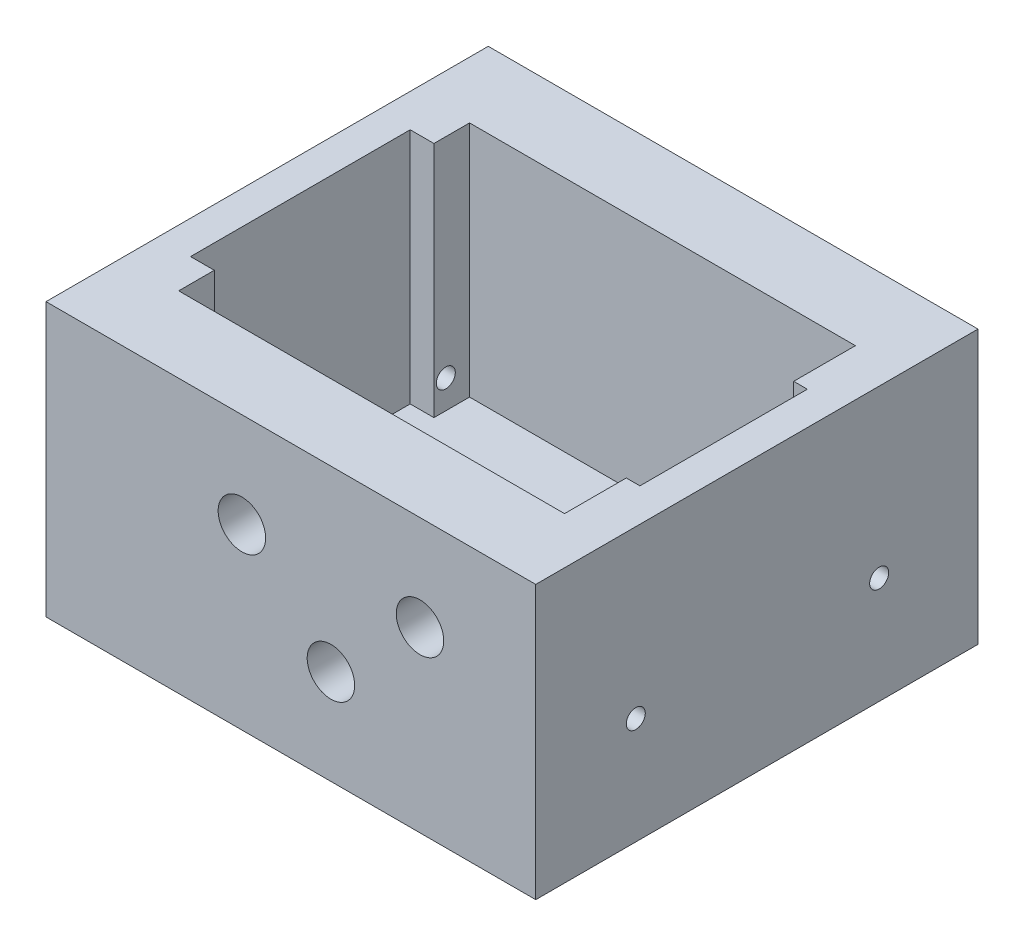
ISO-10303-21;
HEADER;
FILE_DESCRIPTION(('STEP AP214'),'2;1');
FILE_NAME('part.step','',(''),(''),'','','');
FILE_SCHEMA(('AUTOMOTIVE_DESIGN { 1 0 10303 214 1 1 1 1 }'));
ENDSEC;
DATA;
#1=APPLICATION_CONTEXT('core data for automotive mechanical design processes');
#2=APPLICATION_PROTOCOL_DEFINITION('international standard','automotive_design',2000,#1);
#3=PRODUCT_CONTEXT('',#1,'mechanical');
#4=PRODUCT('Part','Part','',(#3));
#5=PRODUCT_RELATED_PRODUCT_CATEGORY('part','',(#4));
#6=PRODUCT_DEFINITION_FORMATION('','',#4);
#7=PRODUCT_DEFINITION_CONTEXT('part definition',#1,'design');
#8=PRODUCT_DEFINITION('design','',#6,#7);
#9=PRODUCT_DEFINITION_SHAPE('','',#8);
#10=(LENGTH_UNIT() NAMED_UNIT(*) SI_UNIT(.MILLI.,.METRE.));
#11=(NAMED_UNIT(*) PLANE_ANGLE_UNIT() SI_UNIT($,.RADIAN.));
#12=(NAMED_UNIT(*) SI_UNIT($,.STERADIAN.) SOLID_ANGLE_UNIT());
#13=UNCERTAINTY_MEASURE_WITH_UNIT(LENGTH_MEASURE(1.E-05),#10,'distance_accuracy_value','');
#14=(GEOMETRIC_REPRESENTATION_CONTEXT(3) GLOBAL_UNCERTAINTY_ASSIGNED_CONTEXT((#13)) GLOBAL_UNIT_ASSIGNED_CONTEXT((#10,
#11,#12)) REPRESENTATION_CONTEXT('',''));
#15=CARTESIAN_POINT('',(0.,0.,0.));
#16=DIRECTION('',(0.,0.,1.));
#17=DIRECTION('',(1.,0.,0.));
#18=AXIS2_PLACEMENT_3D('',#15,#16,#17);
#19=CARTESIAN_POINT('',(0.,23.,0.));
#20=DIRECTION('',(1.,0.,0.));
#21=DIRECTION('',(0.,0.,-1.));
#22=AXIS2_PLACEMENT_3D('',#19,#20,#21);
#23=PLANE('',#22);
#24=CARTESIAN_POINT('',(0.,5.4,-28.875));
#25=DIRECTION('',(1.,0.,0.));
#26=DIRECTION('',(0.,0.,-1.));
#27=AXIS2_PLACEMENT_3D('',#24,#25,#26);
#28=CIRCLE('',#27,0.799999999999999);
#29=CARTESIAN_POINT('',(0.,5.4,-29.675));
#30=VERTEX_POINT('',#29);
#31=EDGE_CURVE('E324',#30,#30,#28,.F.);
#32=ORIENTED_EDGE('',*,*,#31,.F.);
#33=EDGE_LOOP('',(#32));
#34=FACE_BOUND('',#33,.T.);
#35=CARTESIAN_POINT('',(0.,5.4,-8.375));
#36=DIRECTION('',(1.,0.,0.));
#37=DIRECTION('',(0.,0.,-1.));
#38=AXIS2_PLACEMENT_3D('',#35,#36,#37);
#39=CIRCLE('',#38,0.800000000000001);
#40=CARTESIAN_POINT('',(0.,5.4,-9.175));
#41=VERTEX_POINT('',#40);
#42=EDGE_CURVE('E327',#41,#41,#39,.F.);
#43=ORIENTED_EDGE('',*,*,#42,.F.);
#44=EDGE_LOOP('',(#43));
#45=FACE_BOUND('',#44,.T.);
#46=DIRECTION('',(0.,0.,1.));
#47=VECTOR('',#46,1.);
#48=CARTESIAN_POINT('',(0.,0.,0.));
#49=LINE('',#48,#47);
#50=CARTESIAN_POINT('',(0.,0.,-37.25));
#51=VERTEX_POINT('',#50);
#52=CARTESIAN_POINT('',(0.,0.,0.));
#53=VERTEX_POINT('',#52);
#54=EDGE_CURVE('E250',#51,#53,#49,.T.);
#55=ORIENTED_EDGE('',*,*,#54,.T.);
#56=DIRECTION('',(0.,-1.,0.));
#57=VECTOR('',#56,1.);
#58=CARTESIAN_POINT('',(0.,23.,0.));
#59=LINE('',#58,#57);
#60=CARTESIAN_POINT('',(0.,23.,0.));
#61=VERTEX_POINT('',#60);
#62=EDGE_CURVE('E11',#61,#53,#59,.T.);
#63=ORIENTED_EDGE('',*,*,#62,.F.);
#64=DIRECTION('',(0.,0.,1.));
#65=VECTOR('',#64,1.);
#66=CARTESIAN_POINT('',(0.,23.,0.));
#67=LINE('',#66,#65);
#68=CARTESIAN_POINT('',(0.,23.,-37.25));
#69=VERTEX_POINT('',#68);
#70=EDGE_CURVE('E270',#69,#61,#67,.T.);
#71=ORIENTED_EDGE('',*,*,#70,.F.);
#72=DIRECTION('',(0.,-1.,0.));
#73=VECTOR('',#72,1.);
#74=CARTESIAN_POINT('',(0.,23.,-37.25));
#75=LINE('',#74,#73);
#76=EDGE_CURVE('E276',#69,#51,#75,.T.);
#77=ORIENTED_EDGE('',*,*,#76,.T.);
#78=EDGE_LOOP('',(#55,#63,#71,#77));
#79=FACE_BOUND('',#78,.T.);
#80=ADVANCED_FACE('F42',(#34,#45,#79),#23,.F.);
#81=CARTESIAN_POINT('',(0.,23.,0.));
#82=DIRECTION('',(0.,0.,-1.));
#83=DIRECTION('',(-1.,0.,0.));
#84=AXIS2_PLACEMENT_3D('',#81,#82,#83);
#85=PLANE('',#84);
#86=CARTESIAN_POINT('',(16.5,15.,0.));
#87=DIRECTION('',(0.,0.,1.));
#88=DIRECTION('',(1.,0.,0.));
#89=AXIS2_PLACEMENT_3D('',#86,#87,#88);
#90=CIRCLE('',#89,2.);
#91=CARTESIAN_POINT('',(18.5,15.,0.));
#92=VERTEX_POINT('',#91);
#93=EDGE_CURVE('E363',#92,#92,#90,.T.);
#94=ORIENTED_EDGE('',*,*,#93,.F.);
#95=EDGE_LOOP('',(#94));
#96=FACE_BOUND('',#95,.T.);
#97=CARTESIAN_POINT('',(31.5,15.,0.));
#98=DIRECTION('',(0.,0.,1.));
#99=DIRECTION('',(1.,0.,0.));
#100=AXIS2_PLACEMENT_3D('',#97,#98,#99);
#101=CIRCLE('',#100,2.);
#102=CARTESIAN_POINT('',(33.5,15.,0.));
#103=VERTEX_POINT('',#102);
#104=EDGE_CURVE('E360',#103,#103,#101,.T.);
#105=ORIENTED_EDGE('',*,*,#104,.F.);
#106=EDGE_LOOP('',(#105));
#107=FACE_BOUND('',#106,.T.);
#108=CARTESIAN_POINT('',(24.,8.,0.));
#109=DIRECTION('',(0.,0.,1.));
#110=DIRECTION('',(1.,0.,0.));
#111=AXIS2_PLACEMENT_3D('',#108,#109,#110);
#112=CIRCLE('',#111,2.);
#113=CARTESIAN_POINT('',(26.,8.,0.));
#114=VERTEX_POINT('',#113);
#115=EDGE_CURVE('E353',#114,#114,#112,.T.);
#116=ORIENTED_EDGE('',*,*,#115,.F.);
#117=EDGE_LOOP('',(#116));
#118=FACE_BOUND('',#117,.T.);
#119=DIRECTION('',(1.,0.,0.));
#120=VECTOR('',#119,1.);
#121=CARTESIAN_POINT('',(0.,0.,0.));
#122=LINE('',#121,#120);
#123=CARTESIAN_POINT('',(41.25,0.,0.));
#124=VERTEX_POINT('',#123);
#125=EDGE_CURVE('E279',#53,#124,#122,.T.);
#126=ORIENTED_EDGE('',*,*,#125,.T.);
#127=DIRECTION('',(0.,-1.,0.));
#128=VECTOR('',#127,1.);
#129=CARTESIAN_POINT('',(41.25,23.,0.));
#130=LINE('',#129,#128);
#131=CARTESIAN_POINT('',(41.25,23.,0.));
#132=VERTEX_POINT('',#131);
#133=EDGE_CURVE('E49',#132,#124,#130,.T.);
#134=ORIENTED_EDGE('',*,*,#133,.F.);
#135=DIRECTION('',(1.,0.,0.));
#136=VECTOR('',#135,1.);
#137=CARTESIAN_POINT('',(0.,23.,0.));
#138=LINE('',#137,#136);
#139=EDGE_CURVE('E93',#61,#132,#138,.T.);
#140=ORIENTED_EDGE('',*,*,#139,.F.);
#141=ORIENTED_EDGE('',*,*,#62,.T.);
#142=EDGE_LOOP('',(#126,#134,#140,#141));
#143=FACE_BOUND('',#142,.T.);
#144=ADVANCED_FACE('F309',(#96,#107,#118,#143),#85,.F.);
#145=CARTESIAN_POINT('',(41.25,23.,0.));
#146=DIRECTION('',(-1.,0.,0.));
#147=DIRECTION('',(0.,0.,1.));
#148=AXIS2_PLACEMENT_3D('',#145,#146,#147);
#149=PLANE('',#148);
#150=CARTESIAN_POINT('',(41.25,9.,-28.925));
#151=DIRECTION('',(-1.,0.,0.));
#152=DIRECTION('',(0.,0.,1.));
#153=AXIS2_PLACEMENT_3D('',#150,#151,#152);
#154=CIRCLE('',#153,0.799999999999999);
#155=CARTESIAN_POINT('',(41.25,9.,-28.125));
#156=VERTEX_POINT('',#155);
#157=EDGE_CURVE('E220',#156,#156,#154,.F.);
#158=ORIENTED_EDGE('',*,*,#157,.F.);
#159=EDGE_LOOP('',(#158));
#160=FACE_BOUND('',#159,.T.);
#161=CARTESIAN_POINT('',(41.25,9.,-8.425));
#162=DIRECTION('',(-1.,0.,0.));
#163=DIRECTION('',(0.,0.,1.));
#164=AXIS2_PLACEMENT_3D('',#161,#162,#163);
#165=CIRCLE('',#164,0.800000000000002);
#166=CARTESIAN_POINT('',(41.25,9.,-7.625));
#167=VERTEX_POINT('',#166);
#168=EDGE_CURVE('E190',#167,#167,#165,.F.);
#169=ORIENTED_EDGE('',*,*,#168,.F.);
#170=EDGE_LOOP('',(#169));
#171=FACE_BOUND('',#170,.T.);
#172=DIRECTION('',(0.,0.,-1.));
#173=VECTOR('',#172,1.);
#174=CARTESIAN_POINT('',(41.25,0.,0.));
#175=LINE('',#174,#173);
#176=CARTESIAN_POINT('',(41.25,0.,-37.25));
#177=VERTEX_POINT('',#176);
#178=EDGE_CURVE('E281',#124,#177,#175,.T.);
#179=ORIENTED_EDGE('',*,*,#178,.T.);
#180=DIRECTION('',(0.,-1.,0.));
#181=VECTOR('',#180,1.);
#182=CARTESIAN_POINT('',(41.25,23.,-37.25));
#183=LINE('',#182,#181);
#184=CARTESIAN_POINT('',(41.25,23.,-37.25));
#185=VERTEX_POINT('',#184);
#186=EDGE_CURVE('E285',#185,#177,#183,.T.);
#187=ORIENTED_EDGE('',*,*,#186,.F.);
#188=DIRECTION('',(0.,0.,-1.));
#189=VECTOR('',#188,1.);
#190=CARTESIAN_POINT('',(41.25,23.,0.));
#191=LINE('',#190,#189);
#192=EDGE_CURVE('E273',#132,#185,#191,.T.);
#193=ORIENTED_EDGE('',*,*,#192,.F.);
#194=ORIENTED_EDGE('',*,*,#133,.T.);
#195=EDGE_LOOP('',(#179,#187,#193,#194));
#196=FACE_BOUND('',#195,.T.);
#197=ADVANCED_FACE('F290',(#160,#171,#196),#149,.F.);
#198=CARTESIAN_POINT('',(0.,23.,-37.25));
#199=DIRECTION('',(0.,0.,1.));
#200=DIRECTION('',(1.,0.,0.));
#201=AXIS2_PLACEMENT_3D('',#198,#199,#200);
#202=PLANE('',#201);
#203=CARTESIAN_POINT('',(16.5,15.,-37.25));
#204=DIRECTION('',(0.,0.,1.));
#205=DIRECTION('',(1.,0.,0.));
#206=AXIS2_PLACEMENT_3D('',#203,#204,#205);
#207=CIRCLE('',#206,2.);
#208=CARTESIAN_POINT('',(18.5,15.,-37.25));
#209=VERTEX_POINT('',#208);
#210=EDGE_CURVE('E380',#209,#209,#207,.T.);
#211=ORIENTED_EDGE('',*,*,#210,.T.);
#212=EDGE_LOOP('',(#211));
#213=FACE_BOUND('',#212,.T.);
#214=CARTESIAN_POINT('',(31.5,15.,-37.25));
#215=DIRECTION('',(0.,0.,1.));
#216=DIRECTION('',(1.,0.,0.));
#217=AXIS2_PLACEMENT_3D('',#214,#215,#216);
#218=CIRCLE('',#217,2.);
#219=CARTESIAN_POINT('',(33.5,15.,-37.25));
#220=VERTEX_POINT('',#219);
#221=EDGE_CURVE('E374',#220,#220,#218,.T.);
#222=ORIENTED_EDGE('',*,*,#221,.T.);
#223=EDGE_LOOP('',(#222));
#224=FACE_BOUND('',#223,.T.);
#225=CARTESIAN_POINT('',(24.,8.,-37.25));
#226=DIRECTION('',(0.,0.,1.));
#227=DIRECTION('',(1.,0.,0.));
#228=AXIS2_PLACEMENT_3D('',#225,#226,#227);
#229=CIRCLE('',#228,2.);
#230=CARTESIAN_POINT('',(26.,8.,-37.25));
#231=VERTEX_POINT('',#230);
#232=EDGE_CURVE('E368',#231,#231,#229,.T.);
#233=ORIENTED_EDGE('',*,*,#232,.T.);
#234=EDGE_LOOP('',(#233));
#235=FACE_BOUND('',#234,.T.);
#236=DIRECTION('',(-1.,0.,0.));
#237=VECTOR('',#236,1.);
#238=CARTESIAN_POINT('',(0.,0.,-37.25));
#239=LINE('',#238,#237);
#240=EDGE_CURVE('E86',#177,#51,#239,.T.);
#241=ORIENTED_EDGE('',*,*,#240,.T.);
#242=ORIENTED_EDGE('',*,*,#76,.F.);
#243=DIRECTION('',(-1.,0.,0.));
#244=VECTOR('',#243,1.);
#245=CARTESIAN_POINT('',(0.,23.,-37.25));
#246=LINE('',#245,#244);
#247=EDGE_CURVE('E65',#185,#69,#246,.T.);
#248=ORIENTED_EDGE('',*,*,#247,.F.);
#249=ORIENTED_EDGE('',*,*,#186,.T.);
#250=EDGE_LOOP('',(#241,#242,#248,#249));
#251=FACE_BOUND('',#250,.T.);
#252=ADVANCED_FACE('F298',(#213,#224,#235,#251),#202,.F.);
#253=CARTESIAN_POINT('',(0.,23.,0.));
#254=DIRECTION('',(0.,-1.,0.));
#255=DIRECTION('',(0.,0.,-1.));
#256=AXIS2_PLACEMENT_3D('',#253,#254,#255);
#257=PLANE('',#256);
#258=DIRECTION('',(-1.,0.,0.));
#259=VECTOR('',#258,1.);
#260=CARTESIAN_POINT('',(4.8,23.,-27.875));
#261=LINE('',#260,#259);
#262=CARTESIAN_POINT('',(4.8,23.,-27.875));
#263=VERTEX_POINT('',#262);
#264=CARTESIAN_POINT('',(2.80000000000001,23.,-27.875));
#265=VERTEX_POINT('',#264);
#266=EDGE_CURVE('E219',#263,#265,#261,.T.);
#267=ORIENTED_EDGE('',*,*,#266,.F.);
#268=DIRECTION('',(0.,0.,1.));
#269=VECTOR('',#268,1.);
#270=CARTESIAN_POINT('',(4.8,23.,-30.875));
#271=LINE('',#270,#269);
#272=CARTESIAN_POINT('',(4.8,23.,-30.875));
#273=VERTEX_POINT('',#272);
#274=EDGE_CURVE('E56',#273,#263,#271,.T.);
#275=ORIENTED_EDGE('',*,*,#274,.F.);
#276=DIRECTION('',(-1.,0.,0.));
#277=VECTOR('',#276,1.);
#278=CARTESIAN_POINT('',(37.3,23.,-30.875));
#279=LINE('',#278,#277);
#280=CARTESIAN_POINT('',(37.3,23.,-30.875));
#281=VERTEX_POINT('',#280);
#282=EDGE_CURVE('E184',#281,#273,#279,.T.);
#283=ORIENTED_EDGE('',*,*,#282,.F.);
#284=DIRECTION('',(0.,0.,-1.));
#285=VECTOR('',#284,1.);
#286=CARTESIAN_POINT('',(37.3,23.,-25.675));
#287=LINE('',#286,#285);
#288=CARTESIAN_POINT('',(37.3,23.,-25.675));
#289=VERTEX_POINT('',#288);
#290=EDGE_CURVE('E187',#289,#281,#287,.T.);
#291=ORIENTED_EDGE('',*,*,#290,.F.);
#292=DIRECTION('',(-1.,0.,0.));
#293=VECTOR('',#292,1.);
#294=CARTESIAN_POINT('',(38.45,23.,-25.675));
#295=LINE('',#294,#293);
#296=CARTESIAN_POINT('',(38.45,23.,-25.675));
#297=VERTEX_POINT('',#296);
#298=EDGE_CURVE('E243',#297,#289,#295,.T.);
#299=ORIENTED_EDGE('',*,*,#298,.F.);
#300=DIRECTION('',(0.,0.,-1.));
#301=VECTOR('',#300,1.);
#302=CARTESIAN_POINT('',(38.45,23.,-11.575));
#303=LINE('',#302,#301);
#304=CARTESIAN_POINT('',(38.45,23.,-11.575));
#305=VERTEX_POINT('',#304);
#306=EDGE_CURVE('E240',#305,#297,#303,.T.);
#307=ORIENTED_EDGE('',*,*,#306,.F.);
#308=DIRECTION('',(1.,0.,0.));
#309=VECTOR('',#308,1.);
#310=CARTESIAN_POINT('',(37.3,23.,-11.575));
#311=LINE('',#310,#309);
#312=CARTESIAN_POINT('',(37.3,23.,-11.575));
#313=VERTEX_POINT('',#312);
#314=EDGE_CURVE('E237',#313,#305,#311,.T.);
#315=ORIENTED_EDGE('',*,*,#314,.F.);
#316=DIRECTION('',(0.,0.,-1.));
#317=VECTOR('',#316,1.);
#318=CARTESIAN_POINT('',(37.3,23.,-6.375));
#319=LINE('',#318,#317);
#320=CARTESIAN_POINT('',(37.3,23.,-6.375));
#321=VERTEX_POINT('',#320);
#322=EDGE_CURVE('E234',#321,#313,#319,.T.);
#323=ORIENTED_EDGE('',*,*,#322,.F.);
#324=DIRECTION('',(1.,0.,0.));
#325=VECTOR('',#324,1.);
#326=CARTESIAN_POINT('',(4.80000000000001,23.,-6.375));
#327=LINE('',#326,#325);
#328=CARTESIAN_POINT('',(4.80000000000001,23.,-6.375));
#329=VERTEX_POINT('',#328);
#330=EDGE_CURVE('E231',#329,#321,#327,.T.);
#331=ORIENTED_EDGE('',*,*,#330,.F.);
#332=DIRECTION('',(0.,0.,1.));
#333=VECTOR('',#332,1.);
#334=CARTESIAN_POINT('',(4.80000000000001,23.,-9.375));
#335=LINE('',#334,#333);
#336=CARTESIAN_POINT('',(4.80000000000001,23.,-9.375));
#337=VERTEX_POINT('',#336);
#338=EDGE_CURVE('E228',#337,#329,#335,.T.);
#339=ORIENTED_EDGE('',*,*,#338,.F.);
#340=DIRECTION('',(1.,0.,0.));
#341=VECTOR('',#340,1.);
#342=CARTESIAN_POINT('',(2.80000000000001,23.,-9.375));
#343=LINE('',#342,#341);
#344=CARTESIAN_POINT('',(2.80000000000001,23.,-9.375));
#345=VERTEX_POINT('',#344);
#346=EDGE_CURVE('E225',#345,#337,#343,.T.);
#347=ORIENTED_EDGE('',*,*,#346,.F.);
#348=DIRECTION('',(0.,0.,1.));
#349=VECTOR('',#348,1.);
#350=CARTESIAN_POINT('',(2.80000000000001,23.,-27.875));
#351=LINE('',#350,#349);
#352=EDGE_CURVE('E222',#265,#345,#351,.T.);
#353=ORIENTED_EDGE('',*,*,#352,.F.);
#354=EDGE_LOOP('',(#267,#275,#283,#291,#299,#307,#315,#323,#331,#339,#347,#353));
#355=FACE_BOUND('',#354,.T.);
#356=ORIENTED_EDGE('',*,*,#70,.T.);
#357=ORIENTED_EDGE('',*,*,#139,.T.);
#358=ORIENTED_EDGE('',*,*,#192,.T.);
#359=ORIENTED_EDGE('',*,*,#247,.T.);
#360=EDGE_LOOP('',(#356,#357,#358,#359));
#361=FACE_BOUND('',#360,.T.);
#362=ADVANCED_FACE('F300',(#355,#361),#257,.F.);
#363=CARTESIAN_POINT('',(0.,0.,0.));
#364=DIRECTION('',(0.,-1.,0.));
#365=DIRECTION('',(0.,0.,-1.));
#366=AXIS2_PLACEMENT_3D('',#363,#364,#365);
#367=PLANE('',#366);
#368=ORIENTED_EDGE('',*,*,#54,.F.);
#369=ORIENTED_EDGE('',*,*,#240,.F.);
#370=ORIENTED_EDGE('',*,*,#178,.F.);
#371=ORIENTED_EDGE('',*,*,#125,.F.);
#372=EDGE_LOOP('',(#368,#369,#370,#371));
#373=FACE_BOUND('',#372,.T.);
#374=ADVANCED_FACE('F294',(#373),#367,.T.);
#375=CARTESIAN_POINT('',(4.8,3.,-30.875));
#376=DIRECTION('',(-1.,0.,0.));
#377=DIRECTION('',(0.,0.,1.));
#378=AXIS2_PLACEMENT_3D('',#375,#376,#377);
#379=PLANE('',#378);
#380=CARTESIAN_POINT('',(4.8,5.4,-28.875));
#381=DIRECTION('',(1.,0.,0.));
#382=DIRECTION('',(0.,0.,-1.));
#383=AXIS2_PLACEMENT_3D('',#380,#381,#382);
#384=CIRCLE('',#383,0.799999999999999);
#385=CARTESIAN_POINT('',(4.8,5.4,-29.675));
#386=VERTEX_POINT('',#385);
#387=EDGE_CURVE('E329',#386,#386,#384,.T.);
#388=ORIENTED_EDGE('',*,*,#387,.F.);
#389=EDGE_LOOP('',(#388));
#390=FACE_BOUND('',#389,.T.);
#391=ORIENTED_EDGE('',*,*,#274,.T.);
#392=DIRECTION('',(0.,1.,0.));
#393=VECTOR('',#392,1.);
#394=CARTESIAN_POINT('',(4.8,3.,-27.875));
#395=LINE('',#394,#393);
#396=CARTESIAN_POINT('',(4.8,3.,-27.875));
#397=VERTEX_POINT('',#396);
#398=EDGE_CURVE('E161',#397,#263,#395,.T.);
#399=ORIENTED_EDGE('',*,*,#398,.F.);
#400=DIRECTION('',(0.,0.,1.));
#401=VECTOR('',#400,1.);
#402=CARTESIAN_POINT('',(4.8,3.,-30.875));
#403=LINE('',#402,#401);
#404=CARTESIAN_POINT('',(4.8,3.,-30.875));
#405=VERTEX_POINT('',#404);
#406=EDGE_CURVE('E165',#405,#397,#403,.T.);
#407=ORIENTED_EDGE('',*,*,#406,.F.);
#408=DIRECTION('',(0.,1.,0.));
#409=VECTOR('',#408,1.);
#410=CARTESIAN_POINT('',(4.8,3.,-30.875));
#411=LINE('',#410,#409);
#412=EDGE_CURVE('E248',#405,#273,#411,.T.);
#413=ORIENTED_EDGE('',*,*,#412,.T.);
#414=EDGE_LOOP('',(#391,#399,#407,#413));
#415=FACE_BOUND('',#414,.T.);
#416=ADVANCED_FACE('F163',(#390,#415),#379,.F.);
#417=CARTESIAN_POINT('',(37.3,3.,-30.875));
#418=DIRECTION('',(0.,0.,-1.));
#419=DIRECTION('',(-1.,0.,0.));
#420=AXIS2_PLACEMENT_3D('',#417,#418,#419);
#421=PLANE('',#420);
#422=ORIENTED_EDGE('',*,*,#282,.T.);
#423=ORIENTED_EDGE('',*,*,#412,.F.);
#424=DIRECTION('',(-1.,0.,0.));
#425=VECTOR('',#424,1.);
#426=CARTESIAN_POINT('',(37.3,3.,-30.875));
#427=LINE('',#426,#425);
#428=CARTESIAN_POINT('',(37.3,3.,-30.875));
#429=VERTEX_POINT('',#428);
#430=EDGE_CURVE('E171',#429,#405,#427,.T.);
#431=ORIENTED_EDGE('',*,*,#430,.F.);
#432=DIRECTION('',(0.,1.,0.));
#433=VECTOR('',#432,1.);
#434=CARTESIAN_POINT('',(37.3,3.,-30.875));
#435=LINE('',#434,#433);
#436=EDGE_CURVE('E251',#429,#281,#435,.T.);
#437=ORIENTED_EDGE('',*,*,#436,.T.);
#438=EDGE_LOOP('',(#422,#423,#431,#437));
#439=FACE_BOUND('',#438,.T.);
#440=ADVANCED_FACE('F452',(#439),#421,.F.);
#441=CARTESIAN_POINT('',(37.3,3.,-25.675));
#442=DIRECTION('',(1.,0.,0.));
#443=DIRECTION('',(0.,0.,-1.));
#444=AXIS2_PLACEMENT_3D('',#441,#442,#443);
#445=PLANE('',#444);
#446=CARTESIAN_POINT('',(37.3,9.,-28.925));
#447=DIRECTION('',(-1.,0.,0.));
#448=DIRECTION('',(0.,0.,1.));
#449=AXIS2_PLACEMENT_3D('',#446,#447,#448);
#450=CIRCLE('',#449,0.799999999999999);
#451=CARTESIAN_POINT('',(37.3,9.,-28.125));
#452=VERTEX_POINT('',#451);
#453=EDGE_CURVE('E339',#452,#452,#450,.T.);
#454=ORIENTED_EDGE('',*,*,#453,.F.);
#455=EDGE_LOOP('',(#454));
#456=FACE_BOUND('',#455,.T.);
#457=ORIENTED_EDGE('',*,*,#290,.T.);
#458=ORIENTED_EDGE('',*,*,#436,.F.);
#459=DIRECTION('',(0.,0.,-1.));
#460=VECTOR('',#459,1.);
#461=CARTESIAN_POINT('',(37.3,3.,-25.675));
#462=LINE('',#461,#460);
#463=CARTESIAN_POINT('',(37.3,3.,-25.675));
#464=VERTEX_POINT('',#463);
#465=EDGE_CURVE('E215',#464,#429,#462,.T.);
#466=ORIENTED_EDGE('',*,*,#465,.F.);
#467=DIRECTION('',(0.,1.,0.));
#468=VECTOR('',#467,1.);
#469=CARTESIAN_POINT('',(37.3,3.,-25.675));
#470=LINE('',#469,#468);
#471=EDGE_CURVE('E253',#464,#289,#470,.T.);
#472=ORIENTED_EDGE('',*,*,#471,.T.);
#473=EDGE_LOOP('',(#457,#458,#466,#472));
#474=FACE_BOUND('',#473,.T.);
#475=ADVANCED_FACE('F455',(#456,#474),#445,.F.);
#476=CARTESIAN_POINT('',(38.45,3.,-25.675));
#477=DIRECTION('',(0.,0.,-1.));
#478=DIRECTION('',(-1.,0.,0.));
#479=AXIS2_PLACEMENT_3D('',#476,#477,#478);
#480=PLANE('',#479);
#481=ORIENTED_EDGE('',*,*,#298,.T.);
#482=ORIENTED_EDGE('',*,*,#471,.F.);
#483=DIRECTION('',(-1.,0.,0.));
#484=VECTOR('',#483,1.);
#485=CARTESIAN_POINT('',(38.45,3.,-25.675));
#486=LINE('',#485,#484);
#487=CARTESIAN_POINT('',(38.45,3.,-25.675));
#488=VERTEX_POINT('',#487);
#489=EDGE_CURVE('E212',#488,#464,#486,.T.);
#490=ORIENTED_EDGE('',*,*,#489,.F.);
#491=DIRECTION('',(0.,1.,0.));
#492=VECTOR('',#491,1.);
#493=CARTESIAN_POINT('',(38.45,3.,-25.675));
#494=LINE('',#493,#492);
#495=EDGE_CURVE('E255',#488,#297,#494,.T.);
#496=ORIENTED_EDGE('',*,*,#495,.T.);
#497=EDGE_LOOP('',(#481,#482,#490,#496));
#498=FACE_BOUND('',#497,.T.);
#499=ADVANCED_FACE('F459',(#498),#480,.F.);
#500=CARTESIAN_POINT('',(38.45,3.,-11.575));
#501=DIRECTION('',(1.,0.,0.));
#502=DIRECTION('',(0.,0.,-1.));
#503=AXIS2_PLACEMENT_3D('',#500,#501,#502);
#504=PLANE('',#503);
#505=ORIENTED_EDGE('',*,*,#306,.T.);
#506=ORIENTED_EDGE('',*,*,#495,.F.);
#507=DIRECTION('',(0.,0.,-1.));
#508=VECTOR('',#507,1.);
#509=CARTESIAN_POINT('',(38.45,3.,-11.575));
#510=LINE('',#509,#508);
#511=CARTESIAN_POINT('',(38.45,3.,-11.575));
#512=VERTEX_POINT('',#511);
#513=EDGE_CURVE('E209',#512,#488,#510,.T.);
#514=ORIENTED_EDGE('',*,*,#513,.F.);
#515=DIRECTION('',(0.,1.,0.));
#516=VECTOR('',#515,1.);
#517=CARTESIAN_POINT('',(38.45,3.,-11.575));
#518=LINE('',#517,#516);
#519=EDGE_CURVE('E257',#512,#305,#518,.T.);
#520=ORIENTED_EDGE('',*,*,#519,.T.);
#521=EDGE_LOOP('',(#505,#506,#514,#520));
#522=FACE_BOUND('',#521,.T.);
#523=ADVANCED_FACE('F463',(#522),#504,.F.);
#524=CARTESIAN_POINT('',(37.3,3.,-11.575));
#525=DIRECTION('',(0.,0.,1.));
#526=DIRECTION('',(1.,0.,0.));
#527=AXIS2_PLACEMENT_3D('',#524,#525,#526);
#528=PLANE('',#527);
#529=ORIENTED_EDGE('',*,*,#314,.T.);
#530=ORIENTED_EDGE('',*,*,#519,.F.);
#531=DIRECTION('',(1.,0.,0.));
#532=VECTOR('',#531,1.);
#533=CARTESIAN_POINT('',(37.3,3.,-11.575));
#534=LINE('',#533,#532);
#535=CARTESIAN_POINT('',(37.3,3.,-11.575));
#536=VERTEX_POINT('',#535);
#537=EDGE_CURVE('E206',#536,#512,#534,.T.);
#538=ORIENTED_EDGE('',*,*,#537,.F.);
#539=DIRECTION('',(0.,1.,0.));
#540=VECTOR('',#539,1.);
#541=CARTESIAN_POINT('',(37.3,3.,-11.575));
#542=LINE('',#541,#540);
#543=EDGE_CURVE('E259',#536,#313,#542,.T.);
#544=ORIENTED_EDGE('',*,*,#543,.T.);
#545=EDGE_LOOP('',(#529,#530,#538,#544));
#546=FACE_BOUND('',#545,.T.);
#547=ADVANCED_FACE('F467',(#546),#528,.F.);
#548=CARTESIAN_POINT('',(37.3,3.,-6.375));
#549=DIRECTION('',(1.,0.,0.));
#550=DIRECTION('',(0.,0.,-1.));
#551=AXIS2_PLACEMENT_3D('',#548,#549,#550);
#552=PLANE('',#551);
#553=CARTESIAN_POINT('',(37.3,9.,-8.425));
#554=DIRECTION('',(-1.,0.,0.));
#555=DIRECTION('',(0.,0.,1.));
#556=AXIS2_PLACEMENT_3D('',#553,#554,#555);
#557=CIRCLE('',#556,0.800000000000002);
#558=CARTESIAN_POINT('',(37.3,9.,-7.625));
#559=VERTEX_POINT('',#558);
#560=EDGE_CURVE('E343',#559,#559,#557,.T.);
#561=ORIENTED_EDGE('',*,*,#560,.F.);
#562=EDGE_LOOP('',(#561));
#563=FACE_BOUND('',#562,.T.);
#564=ORIENTED_EDGE('',*,*,#322,.T.);
#565=ORIENTED_EDGE('',*,*,#543,.F.);
#566=DIRECTION('',(0.,0.,-1.));
#567=VECTOR('',#566,1.);
#568=CARTESIAN_POINT('',(37.3,3.,-6.375));
#569=LINE('',#568,#567);
#570=CARTESIAN_POINT('',(37.3,3.,-6.375));
#571=VERTEX_POINT('',#570);
#572=EDGE_CURVE('E203',#571,#536,#569,.T.);
#573=ORIENTED_EDGE('',*,*,#572,.F.);
#574=DIRECTION('',(0.,1.,0.));
#575=VECTOR('',#574,1.);
#576=CARTESIAN_POINT('',(37.3,3.,-6.375));
#577=LINE('',#576,#575);
#578=EDGE_CURVE('E261',#571,#321,#577,.T.);
#579=ORIENTED_EDGE('',*,*,#578,.T.);
#580=EDGE_LOOP('',(#564,#565,#573,#579));
#581=FACE_BOUND('',#580,.T.);
#582=ADVANCED_FACE('F471',(#563,#581),#552,.F.);
#583=CARTESIAN_POINT('',(4.80000000000001,3.,-6.375));
#584=DIRECTION('',(0.,0.,1.));
#585=DIRECTION('',(1.,0.,0.));
#586=AXIS2_PLACEMENT_3D('',#583,#584,#585);
#587=PLANE('',#586);
#588=ORIENTED_EDGE('',*,*,#330,.T.);
#589=ORIENTED_EDGE('',*,*,#578,.F.);
#590=DIRECTION('',(1.,0.,0.));
#591=VECTOR('',#590,1.);
#592=CARTESIAN_POINT('',(4.80000000000001,3.,-6.375));
#593=LINE('',#592,#591);
#594=CARTESIAN_POINT('',(4.80000000000001,3.,-6.375));
#595=VERTEX_POINT('',#594);
#596=EDGE_CURVE('E200',#595,#571,#593,.T.);
#597=ORIENTED_EDGE('',*,*,#596,.F.);
#598=DIRECTION('',(0.,1.,0.));
#599=VECTOR('',#598,1.);
#600=CARTESIAN_POINT('',(4.80000000000001,3.,-6.375));
#601=LINE('',#600,#599);
#602=EDGE_CURVE('E263',#595,#329,#601,.T.);
#603=ORIENTED_EDGE('',*,*,#602,.T.);
#604=EDGE_LOOP('',(#588,#589,#597,#603));
#605=FACE_BOUND('',#604,.T.);
#606=ADVANCED_FACE('F475',(#605),#587,.F.);
#607=CARTESIAN_POINT('',(4.80000000000001,3.,-9.375));
#608=DIRECTION('',(-1.,0.,0.));
#609=DIRECTION('',(0.,0.,1.));
#610=AXIS2_PLACEMENT_3D('',#607,#608,#609);
#611=PLANE('',#610);
#612=CARTESIAN_POINT('',(4.8,5.4,-8.375));
#613=DIRECTION('',(1.,0.,0.));
#614=DIRECTION('',(0.,0.,-1.));
#615=AXIS2_PLACEMENT_3D('',#612,#613,#614);
#616=CIRCLE('',#615,0.800000000000001);
#617=CARTESIAN_POINT('',(4.8,5.4,-9.175));
#618=VERTEX_POINT('',#617);
#619=EDGE_CURVE('E330',#618,#618,#616,.T.);
#620=ORIENTED_EDGE('',*,*,#619,.F.);
#621=EDGE_LOOP('',(#620));
#622=FACE_BOUND('',#621,.T.);
#623=ORIENTED_EDGE('',*,*,#338,.T.);
#624=ORIENTED_EDGE('',*,*,#602,.F.);
#625=DIRECTION('',(0.,0.,1.));
#626=VECTOR('',#625,1.);
#627=CARTESIAN_POINT('',(4.80000000000001,3.,-9.375));
#628=LINE('',#627,#626);
#629=CARTESIAN_POINT('',(4.80000000000001,3.,-9.375));
#630=VERTEX_POINT('',#629);
#631=EDGE_CURVE('E197',#630,#595,#628,.T.);
#632=ORIENTED_EDGE('',*,*,#631,.F.);
#633=DIRECTION('',(0.,1.,0.));
#634=VECTOR('',#633,1.);
#635=CARTESIAN_POINT('',(4.80000000000001,3.,-9.375));
#636=LINE('',#635,#634);
#637=EDGE_CURVE('E265',#630,#337,#636,.T.);
#638=ORIENTED_EDGE('',*,*,#637,.T.);
#639=EDGE_LOOP('',(#623,#624,#632,#638));
#640=FACE_BOUND('',#639,.T.);
#641=ADVANCED_FACE('F479',(#622,#640),#611,.F.);
#642=CARTESIAN_POINT('',(2.80000000000001,3.,-9.375));
#643=DIRECTION('',(0.,0.,1.));
#644=DIRECTION('',(1.,0.,0.));
#645=AXIS2_PLACEMENT_3D('',#642,#643,#644);
#646=PLANE('',#645);
#647=ORIENTED_EDGE('',*,*,#346,.T.);
#648=ORIENTED_EDGE('',*,*,#637,.F.);
#649=DIRECTION('',(1.,0.,0.));
#650=VECTOR('',#649,1.);
#651=CARTESIAN_POINT('',(2.80000000000001,3.,-9.375));
#652=LINE('',#651,#650);
#653=CARTESIAN_POINT('',(2.80000000000001,3.,-9.375));
#654=VERTEX_POINT('',#653);
#655=EDGE_CURVE('E194',#654,#630,#652,.T.);
#656=ORIENTED_EDGE('',*,*,#655,.F.);
#657=DIRECTION('',(0.,1.,0.));
#658=VECTOR('',#657,1.);
#659=CARTESIAN_POINT('',(2.80000000000001,3.,-9.375));
#660=LINE('',#659,#658);
#661=EDGE_CURVE('E267',#654,#345,#660,.T.);
#662=ORIENTED_EDGE('',*,*,#661,.T.);
#663=EDGE_LOOP('',(#647,#648,#656,#662));
#664=FACE_BOUND('',#663,.T.);
#665=ADVANCED_FACE('F483',(#664),#646,.F.);
#666=CARTESIAN_POINT('',(2.80000000000001,3.,-27.875));
#667=DIRECTION('',(-1.,0.,0.));
#668=DIRECTION('',(0.,0.,1.));
#669=AXIS2_PLACEMENT_3D('',#666,#667,#668);
#670=PLANE('',#669);
#671=ORIENTED_EDGE('',*,*,#352,.T.);
#672=ORIENTED_EDGE('',*,*,#661,.F.);
#673=DIRECTION('',(0.,0.,1.));
#674=VECTOR('',#673,1.);
#675=CARTESIAN_POINT('',(2.80000000000001,3.,-27.875));
#676=LINE('',#675,#674);
#677=CARTESIAN_POINT('',(2.80000000000001,3.,-27.875));
#678=VERTEX_POINT('',#677);
#679=EDGE_CURVE('E179',#678,#654,#676,.T.);
#680=ORIENTED_EDGE('',*,*,#679,.F.);
#681=DIRECTION('',(0.,1.,0.));
#682=VECTOR('',#681,1.);
#683=CARTESIAN_POINT('',(2.80000000000001,3.,-27.875));
#684=LINE('',#683,#682);
#685=EDGE_CURVE('E170',#678,#265,#684,.T.);
#686=ORIENTED_EDGE('',*,*,#685,.T.);
#687=EDGE_LOOP('',(#671,#672,#680,#686));
#688=FACE_BOUND('',#687,.T.);
#689=ADVANCED_FACE('F487',(#688),#670,.F.);
#690=CARTESIAN_POINT('',(4.8,3.,-27.875));
#691=DIRECTION('',(0.,0.,-1.));
#692=DIRECTION('',(-1.,0.,0.));
#693=AXIS2_PLACEMENT_3D('',#690,#691,#692);
#694=PLANE('',#693);
#695=ORIENTED_EDGE('',*,*,#266,.T.);
#696=ORIENTED_EDGE('',*,*,#685,.F.);
#697=DIRECTION('',(-1.,0.,0.));
#698=VECTOR('',#697,1.);
#699=CARTESIAN_POINT('',(4.8,3.,-27.875));
#700=LINE('',#699,#698);
#701=EDGE_CURVE('E174',#397,#678,#700,.T.);
#702=ORIENTED_EDGE('',*,*,#701,.F.);
#703=ORIENTED_EDGE('',*,*,#398,.T.);
#704=EDGE_LOOP('',(#695,#696,#702,#703));
#705=FACE_BOUND('',#704,.T.);
#706=ADVANCED_FACE('F175',(#705),#694,.F.);
#707=CARTESIAN_POINT('',(0.,3.,0.));
#708=DIRECTION('',(0.,-1.,0.));
#709=DIRECTION('',(0.,0.,-1.));
#710=AXIS2_PLACEMENT_3D('',#707,#708,#709);
#711=PLANE('',#710);
#712=ORIENTED_EDGE('',*,*,#406,.T.);
#713=ORIENTED_EDGE('',*,*,#701,.T.);
#714=ORIENTED_EDGE('',*,*,#679,.T.);
#715=ORIENTED_EDGE('',*,*,#655,.T.);
#716=ORIENTED_EDGE('',*,*,#631,.T.);
#717=ORIENTED_EDGE('',*,*,#596,.T.);
#718=ORIENTED_EDGE('',*,*,#572,.T.);
#719=ORIENTED_EDGE('',*,*,#537,.T.);
#720=ORIENTED_EDGE('',*,*,#513,.T.);
#721=ORIENTED_EDGE('',*,*,#489,.T.);
#722=ORIENTED_EDGE('',*,*,#465,.T.);
#723=ORIENTED_EDGE('',*,*,#430,.T.);
#724=EDGE_LOOP('',(#712,#713,#714,#715,#716,#717,#718,#719,#720,#721,#722,#723));
#725=FACE_BOUND('',#724,.T.);
#726=ADVANCED_FACE('F181',(#725),#711,.F.);
#727=CARTESIAN_POINT('',(43.512741699797,9.,-8.425));
#728=DIRECTION('',(-1.,0.,0.));
#729=DIRECTION('',(0.,0.,1.));
#730=AXIS2_PLACEMENT_3D('',#727,#728,#729);
#731=CYLINDRICAL_SURFACE('',#730,0.800000000000002);
#732=ORIENTED_EDGE('',*,*,#168,.T.);
#733=EDGE_LOOP('',(#732));
#734=FACE_BOUND('',#733,.T.);
#735=ORIENTED_EDGE('',*,*,#560,.T.);
#736=EDGE_LOOP('',(#735));
#737=FACE_BOUND('',#736,.T.);
#738=ADVANCED_FACE('F445',(#734,#737),#731,.F.);
#739=CARTESIAN_POINT('',(43.512741699797,9.,-28.925));
#740=DIRECTION('',(-1.,0.,0.));
#741=DIRECTION('',(0.,0.,1.));
#742=AXIS2_PLACEMENT_3D('',#739,#740,#741);
#743=CYLINDRICAL_SURFACE('',#742,0.799999999999999);
#744=ORIENTED_EDGE('',*,*,#157,.T.);
#745=EDGE_LOOP('',(#744));
#746=FACE_BOUND('',#745,.T.);
#747=ORIENTED_EDGE('',*,*,#453,.T.);
#748=EDGE_LOOP('',(#747));
#749=FACE_BOUND('',#748,.T.);
#750=ADVANCED_FACE('F442',(#746,#749),#743,.F.);
#751=CARTESIAN_POINT('',(-2.26274169979696,5.4,-8.375));
#752=DIRECTION('',(1.,0.,0.));
#753=DIRECTION('',(0.,0.,-1.));
#754=AXIS2_PLACEMENT_3D('',#751,#752,#753);
#755=CYLINDRICAL_SURFACE('',#754,0.800000000000001);
#756=ORIENTED_EDGE('',*,*,#42,.T.);
#757=EDGE_LOOP('',(#756));
#758=FACE_BOUND('',#757,.T.);
#759=ORIENTED_EDGE('',*,*,#619,.T.);
#760=EDGE_LOOP('',(#759));
#761=FACE_BOUND('',#760,.T.);
#762=ADVANCED_FACE('F439',(#758,#761),#755,.F.);
#763=CARTESIAN_POINT('',(-2.26274169979696,5.4,-28.875));
#764=DIRECTION('',(1.,0.,0.));
#765=DIRECTION('',(0.,0.,-1.));
#766=AXIS2_PLACEMENT_3D('',#763,#764,#765);
#767=CYLINDRICAL_SURFACE('',#766,0.799999999999999);
#768=ORIENTED_EDGE('',*,*,#31,.T.);
#769=EDGE_LOOP('',(#768));
#770=FACE_BOUND('',#769,.T.);
#771=ORIENTED_EDGE('',*,*,#387,.T.);
#772=EDGE_LOOP('',(#771));
#773=FACE_BOUND('',#772,.T.);
#774=ADVANCED_FACE('F432',(#770,#773),#767,.F.);
#775=CARTESIAN_POINT('',(24.,8.,-5.5));
#776=DIRECTION('',(0.,0.,1.));
#777=DIRECTION('',(1.,0.,0.));
#778=AXIS2_PLACEMENT_3D('',#775,#776,#777);
#779=CYLINDRICAL_SURFACE('',#778,2.);
#780=CARTESIAN_POINT('',(24.,8.,-5.5));
#781=DIRECTION('',(0.,0.,1.));
#782=DIRECTION('',(1.,0.,0.));
#783=AXIS2_PLACEMENT_3D('',#780,#781,#782);
#784=CIRCLE('',#783,2.);
#785=CARTESIAN_POINT('',(26.,8.,-5.5));
#786=VERTEX_POINT('',#785);
#787=EDGE_CURVE('E350',#786,#786,#784,.T.);
#788=ORIENTED_EDGE('',*,*,#787,.F.);
#789=EDGE_LOOP('',(#788));
#790=FACE_BOUND('',#789,.T.);
#791=ORIENTED_EDGE('',*,*,#115,.T.);
#792=EDGE_LOOP('',(#791));
#793=FACE_BOUND('',#792,.T.);
#794=ADVANCED_FACE('F429',(#790,#793),#779,.F.);
#795=CARTESIAN_POINT('',(24.,8.,-5.5));
#796=DIRECTION('',(0.,0.,1.));
#797=DIRECTION('',(1.,0.,0.));
#798=AXIS2_PLACEMENT_3D('',#795,#796,#797);
#799=PLANE('',#798);
#800=ORIENTED_EDGE('',*,*,#787,.T.);
#801=EDGE_LOOP('',(#800));
#802=FACE_BOUND('',#801,.T.);
#803=ADVANCED_FACE('F424',(#802),#799,.T.);
#804=CARTESIAN_POINT('',(31.5,15.,-5.5));
#805=DIRECTION('',(0.,0.,1.));
#806=DIRECTION('',(1.,0.,0.));
#807=AXIS2_PLACEMENT_3D('',#804,#805,#806);
#808=CYLINDRICAL_SURFACE('',#807,2.);
#809=CARTESIAN_POINT('',(31.5,15.,-5.5));
#810=DIRECTION('',(0.,0.,1.));
#811=DIRECTION('',(1.,0.,0.));
#812=AXIS2_PLACEMENT_3D('',#809,#810,#811);
#813=CIRCLE('',#812,2.);
#814=CARTESIAN_POINT('',(33.5,15.,-5.5));
#815=VERTEX_POINT('',#814);
#816=EDGE_CURVE('E357',#815,#815,#813,.T.);
#817=ORIENTED_EDGE('',*,*,#816,.F.);
#818=EDGE_LOOP('',(#817));
#819=FACE_BOUND('',#818,.T.);
#820=ORIENTED_EDGE('',*,*,#104,.T.);
#821=EDGE_LOOP('',(#820));
#822=FACE_BOUND('',#821,.T.);
#823=ADVANCED_FACE('F421',(#819,#822),#808,.F.);
#824=CARTESIAN_POINT('',(31.5,15.,-5.5));
#825=DIRECTION('',(0.,0.,1.));
#826=DIRECTION('',(1.,0.,0.));
#827=AXIS2_PLACEMENT_3D('',#824,#825,#826);
#828=PLANE('',#827);
#829=ORIENTED_EDGE('',*,*,#816,.T.);
#830=EDGE_LOOP('',(#829));
#831=FACE_BOUND('',#830,.T.);
#832=ADVANCED_FACE('F419',(#831),#828,.T.);
#833=CARTESIAN_POINT('',(16.5,15.,-5.5));
#834=DIRECTION('',(0.,0.,1.));
#835=DIRECTION('',(1.,0.,0.));
#836=AXIS2_PLACEMENT_3D('',#833,#834,#835);
#837=CYLINDRICAL_SURFACE('',#836,2.);
#838=CARTESIAN_POINT('',(16.5,15.,-5.5));
#839=DIRECTION('',(0.,0.,1.));
#840=DIRECTION('',(1.,0.,0.));
#841=AXIS2_PLACEMENT_3D('',#838,#839,#840);
#842=CIRCLE('',#841,2.);
#843=CARTESIAN_POINT('',(18.5,15.,-5.5));
#844=VERTEX_POINT('',#843);
#845=EDGE_CURVE('E335',#844,#844,#842,.T.);
#846=ORIENTED_EDGE('',*,*,#845,.F.);
#847=EDGE_LOOP('',(#846));
#848=FACE_BOUND('',#847,.T.);
#849=ORIENTED_EDGE('',*,*,#93,.T.);
#850=EDGE_LOOP('',(#849));
#851=FACE_BOUND('',#850,.T.);
#852=ADVANCED_FACE('F415',(#848,#851),#837,.F.);
#853=CARTESIAN_POINT('',(16.5,15.,-5.5));
#854=DIRECTION('',(0.,0.,1.));
#855=DIRECTION('',(1.,0.,0.));
#856=AXIS2_PLACEMENT_3D('',#853,#854,#855);
#857=PLANE('',#856);
#858=ORIENTED_EDGE('',*,*,#845,.T.);
#859=EDGE_LOOP('',(#858));
#860=FACE_BOUND('',#859,.T.);
#861=ADVANCED_FACE('F411',(#860),#857,.T.);
#862=CARTESIAN_POINT('',(24.,8.,-31.75));
#863=DIRECTION('',(0.,0.,-1.));
#864=DIRECTION('',(-1.,0.,0.));
#865=AXIS2_PLACEMENT_3D('',#862,#863,#864);
#866=CYLINDRICAL_SURFACE('',#865,2.);
#867=CARTESIAN_POINT('',(24.,8.,-31.75));
#868=DIRECTION('',(0.,0.,1.));
#869=DIRECTION('',(1.,0.,0.));
#870=AXIS2_PLACEMENT_3D('',#867,#868,#869);
#871=CIRCLE('',#870,2.);
#872=CARTESIAN_POINT('',(26.,8.,-31.75));
#873=VERTEX_POINT('',#872);
#874=EDGE_CURVE('E371',#873,#873,#871,.T.);
#875=ORIENTED_EDGE('',*,*,#874,.T.);
#876=EDGE_LOOP('',(#875));
#877=FACE_BOUND('',#876,.T.);
#878=ORIENTED_EDGE('',*,*,#232,.F.);
#879=EDGE_LOOP('',(#878));
#880=FACE_BOUND('',#879,.T.);
#881=ADVANCED_FACE('F407',(#877,#880),#866,.F.);
#882=CARTESIAN_POINT('',(24.,8.,-31.75));
#883=DIRECTION('',(0.,0.,-1.));
#884=DIRECTION('',(1.,0.,0.));
#885=AXIS2_PLACEMENT_3D('',#882,#883,#884);
#886=PLANE('',#885);
#887=ORIENTED_EDGE('',*,*,#874,.F.);
#888=EDGE_LOOP('',(#887));
#889=FACE_BOUND('',#888,.T.);
#890=ADVANCED_FACE('F403',(#889),#886,.T.);
#891=CARTESIAN_POINT('',(31.5,15.,-31.75));
#892=DIRECTION('',(0.,0.,-1.));
#893=DIRECTION('',(-1.,0.,0.));
#894=AXIS2_PLACEMENT_3D('',#891,#892,#893);
#895=CYLINDRICAL_SURFACE('',#894,2.);
#896=CARTESIAN_POINT('',(31.5,15.,-31.75));
#897=DIRECTION('',(0.,0.,1.));
#898=DIRECTION('',(1.,0.,0.));
#899=AXIS2_PLACEMENT_3D('',#896,#897,#898);
#900=CIRCLE('',#899,2.);
#901=CARTESIAN_POINT('',(33.5,15.,-31.75));
#902=VERTEX_POINT('',#901);
#903=EDGE_CURVE('E377',#902,#902,#900,.T.);
#904=ORIENTED_EDGE('',*,*,#903,.T.);
#905=EDGE_LOOP('',(#904));
#906=FACE_BOUND('',#905,.T.);
#907=ORIENTED_EDGE('',*,*,#221,.F.);
#908=EDGE_LOOP('',(#907));
#909=FACE_BOUND('',#908,.T.);
#910=ADVANCED_FACE('F399',(#906,#909),#895,.F.);
#911=CARTESIAN_POINT('',(31.5,15.,-31.75));
#912=DIRECTION('',(0.,0.,-1.));
#913=DIRECTION('',(1.,0.,0.));
#914=AXIS2_PLACEMENT_3D('',#911,#912,#913);
#915=PLANE('',#914);
#916=ORIENTED_EDGE('',*,*,#903,.F.);
#917=EDGE_LOOP('',(#916));
#918=FACE_BOUND('',#917,.T.);
#919=ADVANCED_FACE('F394',(#918),#915,.T.);
#920=CARTESIAN_POINT('',(16.5,15.,-31.75));
#921=DIRECTION('',(0.,0.,-1.));
#922=DIRECTION('',(-1.,0.,0.));
#923=AXIS2_PLACEMENT_3D('',#920,#921,#922);
#924=CYLINDRICAL_SURFACE('',#923,2.);
#925=CARTESIAN_POINT('',(16.5,15.,-31.75));
#926=DIRECTION('',(0.,0.,1.));
#927=DIRECTION('',(1.,0.,0.));
#928=AXIS2_PLACEMENT_3D('',#925,#926,#927);
#929=CIRCLE('',#928,2.);
#930=CARTESIAN_POINT('',(18.5,15.,-31.75));
#931=VERTEX_POINT('',#930);
#932=EDGE_CURVE('E354',#931,#931,#929,.T.);
#933=ORIENTED_EDGE('',*,*,#932,.T.);
#934=EDGE_LOOP('',(#933));
#935=FACE_BOUND('',#934,.T.);
#936=ORIENTED_EDGE('',*,*,#210,.F.);
#937=EDGE_LOOP('',(#936));
#938=FACE_BOUND('',#937,.T.);
#939=ADVANCED_FACE('F385',(#935,#938),#924,.F.);
#940=CARTESIAN_POINT('',(16.5,15.,-31.75));
#941=DIRECTION('',(0.,0.,-1.));
#942=DIRECTION('',(1.,0.,0.));
#943=AXIS2_PLACEMENT_3D('',#940,#941,#942);
#944=PLANE('',#943);
#945=ORIENTED_EDGE('',*,*,#932,.F.);
#946=EDGE_LOOP('',(#945));
#947=FACE_BOUND('',#946,.T.);
#948=ADVANCED_FACE('F388',(#947),#944,.T.);
#949=CLOSED_SHELL('',(#80,#144,#197,#252,#362,#374,#416,#440,#475,#499,#523,#547,#582,#606,#641,
#665,#689,#706,#726,#738,#750,#762,#774,#794,#803,#823,#832,#852,#861,#881,#890,#910,#919,#939,#948));
#950=MANIFOLD_SOLID_BREP('B2',#949);
#951=ADVANCED_BREP_SHAPE_REPRESENTATION('',(#18,#950),#14);
#952=SHAPE_DEFINITION_REPRESENTATION(#9,#951);
ENDSEC;
END-ISO-10303-21;
